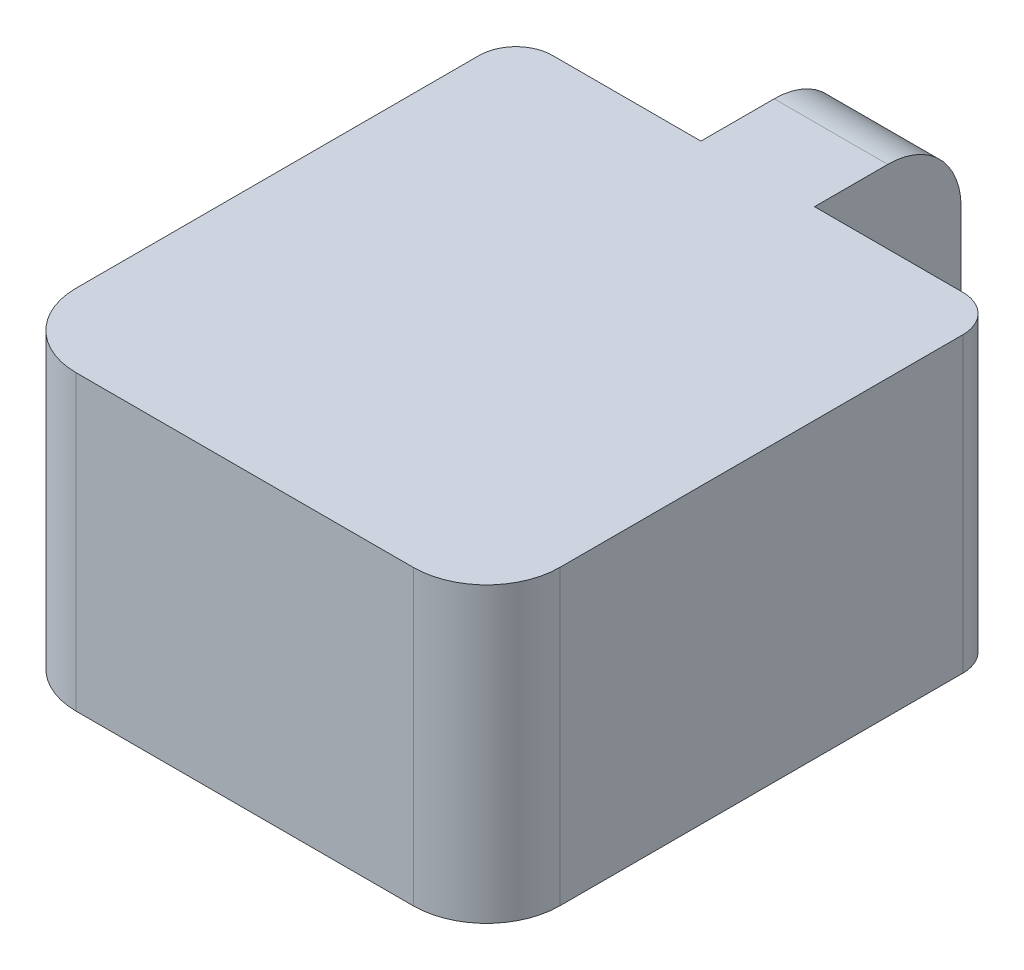
ISO-10303-21;
HEADER;
FILE_DESCRIPTION(('STEP AP214'),'2;1');
FILE_NAME('part.step','',(''),(''),'','','');
FILE_SCHEMA(('AUTOMOTIVE_DESIGN { 1 0 10303 214 1 1 1 1 }'));
ENDSEC;
DATA;
#1=APPLICATION_CONTEXT('core data for automotive mechanical design processes');
#2=APPLICATION_PROTOCOL_DEFINITION('international standard','automotive_design',2000,#1);
#3=PRODUCT_CONTEXT('',#1,'mechanical');
#4=PRODUCT('Part','Part','',(#3));
#5=PRODUCT_RELATED_PRODUCT_CATEGORY('part','',(#4));
#6=PRODUCT_DEFINITION_FORMATION('','',#4);
#7=PRODUCT_DEFINITION_CONTEXT('part definition',#1,'design');
#8=PRODUCT_DEFINITION('design','',#6,#7);
#9=PRODUCT_DEFINITION_SHAPE('','',#8);
#10=(LENGTH_UNIT() NAMED_UNIT(*) SI_UNIT(.MILLI.,.METRE.));
#11=(NAMED_UNIT(*) PLANE_ANGLE_UNIT() SI_UNIT($,.RADIAN.));
#12=(NAMED_UNIT(*) SI_UNIT($,.STERADIAN.) SOLID_ANGLE_UNIT());
#13=UNCERTAINTY_MEASURE_WITH_UNIT(LENGTH_MEASURE(1.E-05),#10,'distance_accuracy_value','');
#14=(GEOMETRIC_REPRESENTATION_CONTEXT(3) GLOBAL_UNCERTAINTY_ASSIGNED_CONTEXT((#13)) GLOBAL_UNIT_ASSIGNED_CONTEXT((#10,
#11,#12)) REPRESENTATION_CONTEXT('',''));
#15=CARTESIAN_POINT('',(0.,0.,0.));
#16=DIRECTION('',(0.,0.,1.));
#17=DIRECTION('',(1.,0.,0.));
#18=AXIS2_PLACEMENT_3D('',#15,#16,#17);
#19=CARTESIAN_POINT('',(0.,40.,20.));
#20=DIRECTION('',(1.,0.,0.));
#21=DIRECTION('',(0.,0.,-1.));
#22=AXIS2_PLACEMENT_3D('',#19,#20,#21);
#23=PLANE('',#22);
#24=CARTESIAN_POINT('',(0.,20.,10.));
#25=DIRECTION('',(-1.,0.,0.));
#26=DIRECTION('',(0.,0.,1.));
#27=AXIS2_PLACEMENT_3D('',#24,#25,#26);
#28=CIRCLE('',#27,5.);
#29=CARTESIAN_POINT('',(0.,20.,15.));
#30=VERTEX_POINT('',#29);
#31=EDGE_CURVE('E390',#30,#30,#28,.T.);
#32=ORIENTED_EDGE('',*,*,#31,.F.);
#33=EDGE_LOOP('',(#32));
#34=FACE_BOUND('',#33,.T.);
#35=DIRECTION('',(0.,-1.,0.));
#36=VECTOR('',#35,1.);
#37=CARTESIAN_POINT('',(0.,40.,0.));
#38=LINE('',#37,#36);
#39=CARTESIAN_POINT('',(0.,30.,0.));
#40=VERTEX_POINT('',#39);
#41=CARTESIAN_POINT('',(0.,15.,0.));
#42=VERTEX_POINT('',#41);
#43=EDGE_CURVE('E234',#40,#42,#38,.T.);
#44=ORIENTED_EDGE('',*,*,#43,.T.);
#45=CARTESIAN_POINT('',(0.,15.,5.));
#46=DIRECTION('',(1.,0.,0.));
#47=DIRECTION('',(0.,0.,-1.));
#48=AXIS2_PLACEMENT_3D('',#45,#46,#47);
#49=CIRCLE('',#48,5.);
#50=CARTESIAN_POINT('',(0.,10.,5.));
#51=VERTEX_POINT('',#50);
#52=EDGE_CURVE('E152',#42,#51,#49,.F.);
#53=ORIENTED_EDGE('',*,*,#52,.T.);
#54=DIRECTION('',(0.,0.,-1.));
#55=VECTOR('',#54,1.);
#56=CARTESIAN_POINT('',(0.,10.,0.));
#57=LINE('',#56,#55);
#58=CARTESIAN_POINT('',(0.,10.,20.));
#59=VERTEX_POINT('',#58);
#60=EDGE_CURVE('E138',#59,#51,#57,.T.);
#61=ORIENTED_EDGE('',*,*,#60,.F.);
#62=DIRECTION('',(0.,-1.,0.));
#63=VECTOR('',#62,1.);
#64=CARTESIAN_POINT('',(0.,40.,20.));
#65=LINE('',#64,#63);
#66=CARTESIAN_POINT('',(0.,40.,20.));
#67=VERTEX_POINT('',#66);
#68=EDGE_CURVE('E151',#67,#59,#65,.T.);
#69=ORIENTED_EDGE('',*,*,#68,.F.);
#70=DIRECTION('',(0.,0.,1.));
#71=VECTOR('',#70,1.);
#72=CARTESIAN_POINT('',(0.,40.,20.));
#73=LINE('',#72,#71);
#74=CARTESIAN_POINT('',(0.,40.,10.));
#75=VERTEX_POINT('',#74);
#76=EDGE_CURVE('E226',#75,#67,#73,.T.);
#77=ORIENTED_EDGE('',*,*,#76,.F.);
#78=CARTESIAN_POINT('',(0.,30.,10.));
#79=DIRECTION('',(1.,0.,0.));
#80=DIRECTION('',(0.,0.,-1.));
#81=AXIS2_PLACEMENT_3D('',#78,#79,#80);
#82=CIRCLE('',#81,10.);
#83=EDGE_CURVE('E163',#75,#40,#82,.F.);
#84=ORIENTED_EDGE('',*,*,#83,.T.);
#85=EDGE_LOOP('',(#44,#53,#61,#69,#77,#84));
#86=FACE_BOUND('',#85,.T.);
#87=ADVANCED_FACE('F33',(#34,#86),#23,.F.);
#88=CARTESIAN_POINT('',(-25.25,40.,90.));
#89=DIRECTION('',(1.,0.,0.));
#90=DIRECTION('',(0.,0.,-1.));
#91=AXIS2_PLACEMENT_3D('',#88,#89,#90);
#92=PLANE('',#91);
#93=DIRECTION('',(0.,0.,1.));
#94=VECTOR('',#93,1.);
#95=CARTESIAN_POINT('',(-25.25,40.,90.));
#96=LINE('',#95,#94);
#97=CARTESIAN_POINT('',(-25.25,40.,25.));
#98=VERTEX_POINT('',#97);
#99=CARTESIAN_POINT('',(-25.25,40.,80.));
#100=VERTEX_POINT('',#99);
#101=EDGE_CURVE('E255',#98,#100,#96,.T.);
#102=ORIENTED_EDGE('',*,*,#101,.F.);
#103=DIRECTION('',(0.,-1.,0.));
#104=VECTOR('',#103,1.);
#105=CARTESIAN_POINT('',(-25.25,40.,25.));
#106=LINE('',#105,#104);
#107=CARTESIAN_POINT('',(-25.25,0.,25.));
#108=VERTEX_POINT('',#107);
#109=EDGE_CURVE('E204',#98,#108,#106,.T.);
#110=ORIENTED_EDGE('',*,*,#109,.T.);
#111=DIRECTION('',(0.,0.,1.));
#112=VECTOR('',#111,1.);
#113=CARTESIAN_POINT('',(-25.25,0.,90.));
#114=LINE('',#113,#112);
#115=CARTESIAN_POINT('',(-25.25,0.,80.));
#116=VERTEX_POINT('',#115);
#117=EDGE_CURVE('E250',#108,#116,#114,.T.);
#118=ORIENTED_EDGE('',*,*,#117,.T.);
#119=DIRECTION('',(0.,-1.,0.));
#120=VECTOR('',#119,1.);
#121=CARTESIAN_POINT('',(-25.25,40.,80.));
#122=LINE('',#121,#120);
#123=EDGE_CURVE('E191',#116,#100,#122,.F.);
#124=ORIENTED_EDGE('',*,*,#123,.T.);
#125=EDGE_LOOP('',(#102,#110,#118,#124));
#126=FACE_BOUND('',#125,.T.);
#127=ADVANCED_FACE('F285',(#126),#92,.F.);
#128=CARTESIAN_POINT('',(40.75,40.,90.));
#129=DIRECTION('',(0.,0.,-1.));
#130=DIRECTION('',(-1.,0.,0.));
#131=AXIS2_PLACEMENT_3D('',#128,#129,#130);
#132=PLANE('',#131);
#133=DIRECTION('',(1.,0.,0.));
#134=VECTOR('',#133,1.);
#135=CARTESIAN_POINT('',(40.75,40.,90.));
#136=LINE('',#135,#134);
#137=CARTESIAN_POINT('',(-15.25,40.,90.));
#138=VERTEX_POINT('',#137);
#139=CARTESIAN_POINT('',(30.75,40.,90.));
#140=VERTEX_POINT('',#139);
#141=EDGE_CURVE('E257',#138,#140,#136,.T.);
#142=ORIENTED_EDGE('',*,*,#141,.F.);
#143=DIRECTION('',(0.,-1.,0.));
#144=VECTOR('',#143,1.);
#145=CARTESIAN_POINT('',(-15.25,40.,90.));
#146=LINE('',#145,#144);
#147=CARTESIAN_POINT('',(-15.25,0.,90.));
#148=VERTEX_POINT('',#147);
#149=EDGE_CURVE('E185',#138,#148,#146,.T.);
#150=ORIENTED_EDGE('',*,*,#149,.T.);
#151=DIRECTION('',(1.,0.,0.));
#152=VECTOR('',#151,1.);
#153=CARTESIAN_POINT('',(40.75,0.,90.));
#154=LINE('',#153,#152);
#155=CARTESIAN_POINT('',(30.75,0.,90.));
#156=VERTEX_POINT('',#155);
#157=EDGE_CURVE('E230',#148,#156,#154,.T.);
#158=ORIENTED_EDGE('',*,*,#157,.T.);
#159=DIRECTION('',(0.,-1.,0.));
#160=VECTOR('',#159,1.);
#161=CARTESIAN_POINT('',(30.75,40.,90.));
#162=LINE('',#161,#160);
#163=EDGE_CURVE('E180',#156,#140,#162,.F.);
#164=ORIENTED_EDGE('',*,*,#163,.T.);
#165=EDGE_LOOP('',(#142,#150,#158,#164));
#166=FACE_BOUND('',#165,.T.);
#167=ADVANCED_FACE('F266',(#166),#132,.F.);
#168=CARTESIAN_POINT('',(40.75,40.,20.));
#169=DIRECTION('',(-1.,0.,0.));
#170=DIRECTION('',(0.,0.,1.));
#171=AXIS2_PLACEMENT_3D('',#168,#169,#170);
#172=PLANE('',#171);
#173=DIRECTION('',(0.,0.,-1.));
#174=VECTOR('',#173,1.);
#175=CARTESIAN_POINT('',(40.75,0.,20.));
#176=LINE('',#175,#174);
#177=CARTESIAN_POINT('',(40.75,0.,80.));
#178=VERTEX_POINT('',#177);
#179=CARTESIAN_POINT('',(40.75,0.,25.));
#180=VERTEX_POINT('',#179);
#181=EDGE_CURVE('E227',#178,#180,#176,.T.);
#182=ORIENTED_EDGE('',*,*,#181,.T.);
#183=DIRECTION('',(0.,-1.,0.));
#184=VECTOR('',#183,1.);
#185=CARTESIAN_POINT('',(40.75,40.,25.));
#186=LINE('',#185,#184);
#187=CARTESIAN_POINT('',(40.75,40.,25.));
#188=VERTEX_POINT('',#187);
#189=EDGE_CURVE('E42',#180,#188,#186,.F.);
#190=ORIENTED_EDGE('',*,*,#189,.T.);
#191=DIRECTION('',(0.,0.,-1.));
#192=VECTOR('',#191,1.);
#193=CARTESIAN_POINT('',(40.75,40.,20.));
#194=LINE('',#193,#192);
#195=CARTESIAN_POINT('',(40.75,40.,80.));
#196=VERTEX_POINT('',#195);
#197=EDGE_CURVE('E259',#196,#188,#194,.T.);
#198=ORIENTED_EDGE('',*,*,#197,.F.);
#199=DIRECTION('',(0.,-1.,0.));
#200=VECTOR('',#199,1.);
#201=CARTESIAN_POINT('',(40.75,40.,80.));
#202=LINE('',#201,#200);
#203=EDGE_CURVE('E174',#196,#178,#202,.T.);
#204=ORIENTED_EDGE('',*,*,#203,.T.);
#205=EDGE_LOOP('',(#182,#190,#198,#204));
#206=FACE_BOUND('',#205,.T.);
#207=ADVANCED_FACE('F275',(#206),#172,.F.);
#208=CARTESIAN_POINT('',(15.5,40.,20.));
#209=DIRECTION('',(0.,0.,1.));
#210=DIRECTION('',(1.,0.,0.));
#211=AXIS2_PLACEMENT_3D('',#208,#209,#210);
#212=PLANE('',#211);
#213=DIRECTION('',(-1.,0.,0.));
#214=VECTOR('',#213,1.);
#215=CARTESIAN_POINT('',(15.5,40.,20.));
#216=LINE('',#215,#214);
#217=CARTESIAN_POINT('',(35.75,40.,20.));
#218=VERTEX_POINT('',#217);
#219=CARTESIAN_POINT('',(15.5,40.,20.));
#220=VERTEX_POINT('',#219);
#221=EDGE_CURVE('E220',#218,#220,#216,.T.);
#222=ORIENTED_EDGE('',*,*,#221,.F.);
#223=DIRECTION('',(0.,-1.,0.));
#224=VECTOR('',#223,1.);
#225=CARTESIAN_POINT('',(35.75,40.,20.));
#226=LINE('',#225,#224);
#227=CARTESIAN_POINT('',(35.75,0.,20.));
#228=VERTEX_POINT('',#227);
#229=EDGE_CURVE('E214',#218,#228,#226,.T.);
#230=ORIENTED_EDGE('',*,*,#229,.T.);
#231=DIRECTION('',(-1.,0.,0.));
#232=VECTOR('',#231,1.);
#233=CARTESIAN_POINT('',(15.5,0.,20.));
#234=LINE('',#233,#232);
#235=CARTESIAN_POINT('',(-20.25,0.,20.));
#236=VERTEX_POINT('',#235);
#237=EDGE_CURVE('E219',#228,#236,#234,.T.);
#238=ORIENTED_EDGE('',*,*,#237,.T.);
#239=DIRECTION('',(0.,-1.,0.));
#240=VECTOR('',#239,1.);
#241=CARTESIAN_POINT('',(-20.25,40.,20.));
#242=LINE('',#241,#240);
#243=CARTESIAN_POINT('',(-20.25,40.,20.));
#244=VERTEX_POINT('',#243);
#245=EDGE_CURVE('E210',#236,#244,#242,.F.);
#246=ORIENTED_EDGE('',*,*,#245,.T.);
#247=DIRECTION('',(-1.,0.,0.));
#248=VECTOR('',#247,1.);
#249=CARTESIAN_POINT('',(-25.25,40.,20.));
#250=LINE('',#249,#248);
#251=EDGE_CURVE('E158',#67,#244,#250,.T.);
#252=ORIENTED_EDGE('',*,*,#251,.F.);
#253=ORIENTED_EDGE('',*,*,#68,.T.);
#254=DIRECTION('',(-1.,0.,0.));
#255=VECTOR('',#254,1.);
#256=CARTESIAN_POINT('',(40.,10.,20.));
#257=LINE('',#256,#255);
#258=CARTESIAN_POINT('',(15.5,10.,20.));
#259=VERTEX_POINT('',#258);
#260=EDGE_CURVE('E135',#259,#59,#257,.T.);
#261=ORIENTED_EDGE('',*,*,#260,.F.);
#262=DIRECTION('',(0.,-1.,0.));
#263=VECTOR('',#262,1.);
#264=CARTESIAN_POINT('',(15.5,40.,20.));
#265=LINE('',#264,#263);
#266=EDGE_CURVE('E160',#220,#259,#265,.T.);
#267=ORIENTED_EDGE('',*,*,#266,.F.);
#268=EDGE_LOOP('',(#222,#230,#238,#246,#252,#253,#261,#267));
#269=FACE_BOUND('',#268,.T.);
#270=ADVANCED_FACE('F156',(#269),#212,.F.);
#271=CARTESIAN_POINT('',(15.5,40.,0.));
#272=DIRECTION('',(-1.,0.,0.));
#273=DIRECTION('',(0.,0.,1.));
#274=AXIS2_PLACEMENT_3D('',#271,#272,#273);
#275=PLANE('',#274);
#276=CARTESIAN_POINT('',(15.5,20.,10.));
#277=DIRECTION('',(-1.,0.,0.));
#278=DIRECTION('',(0.,0.,1.));
#279=AXIS2_PLACEMENT_3D('',#276,#277,#278);
#280=CIRCLE('',#279,5.);
#281=CARTESIAN_POINT('',(15.5,20.,15.));
#282=VERTEX_POINT('',#281);
#283=EDGE_CURVE('E37',#282,#282,#280,.T.);
#284=ORIENTED_EDGE('',*,*,#283,.T.);
#285=EDGE_LOOP('',(#284));
#286=FACE_BOUND('',#285,.T.);
#287=DIRECTION('',(0.,0.,-1.));
#288=VECTOR('',#287,1.);
#289=CARTESIAN_POINT('',(15.5,10.,0.));
#290=LINE('',#289,#288);
#291=CARTESIAN_POINT('',(15.5,10.,5.));
#292=VERTEX_POINT('',#291);
#293=EDGE_CURVE('E141',#259,#292,#290,.T.);
#294=ORIENTED_EDGE('',*,*,#293,.T.);
#295=CARTESIAN_POINT('',(15.5,15.,5.));
#296=DIRECTION('',(-1.,0.,0.));
#297=DIRECTION('',(0.,0.,1.));
#298=AXIS2_PLACEMENT_3D('',#295,#296,#297);
#299=CIRCLE('',#298,5.);
#300=CARTESIAN_POINT('',(15.5,15.,0.));
#301=VERTEX_POINT('',#300);
#302=EDGE_CURVE('E202',#292,#301,#299,.F.);
#303=ORIENTED_EDGE('',*,*,#302,.T.);
#304=DIRECTION('',(0.,-1.,0.));
#305=VECTOR('',#304,1.);
#306=CARTESIAN_POINT('',(15.5,40.,0.));
#307=LINE('',#306,#305);
#308=CARTESIAN_POINT('',(15.5,30.,0.));
#309=VERTEX_POINT('',#308);
#310=EDGE_CURVE('E165',#309,#301,#307,.T.);
#311=ORIENTED_EDGE('',*,*,#310,.F.);
#312=CARTESIAN_POINT('',(15.5,30.,10.));
#313=DIRECTION('',(-1.,0.,0.));
#314=DIRECTION('',(0.,0.,1.));
#315=AXIS2_PLACEMENT_3D('',#312,#313,#314);
#316=CIRCLE('',#315,10.);
#317=CARTESIAN_POINT('',(15.5,40.,10.));
#318=VERTEX_POINT('',#317);
#319=EDGE_CURVE('E172',#309,#318,#316,.F.);
#320=ORIENTED_EDGE('',*,*,#319,.T.);
#321=DIRECTION('',(0.,0.,-1.));
#322=VECTOR('',#321,1.);
#323=CARTESIAN_POINT('',(15.5,40.,0.));
#324=LINE('',#323,#322);
#325=EDGE_CURVE('E235',#220,#318,#324,.T.);
#326=ORIENTED_EDGE('',*,*,#325,.F.);
#327=ORIENTED_EDGE('',*,*,#266,.T.);
#328=EDGE_LOOP('',(#294,#303,#311,#320,#326,#327));
#329=FACE_BOUND('',#328,.T.);
#330=ADVANCED_FACE('F248',(#286,#329),#275,.F.);
#331=CARTESIAN_POINT('',(0.,40.,0.));
#332=DIRECTION('',(0.,0.,1.));
#333=DIRECTION('',(1.,0.,0.));
#334=AXIS2_PLACEMENT_3D('',#331,#332,#333);
#335=PLANE('',#334);
#336=ORIENTED_EDGE('',*,*,#310,.T.);
#337=DIRECTION('',(-1.,0.,0.));
#338=VECTOR('',#337,1.);
#339=CARTESIAN_POINT('',(0.,15.,0.));
#340=LINE('',#339,#338);
#341=EDGE_CURVE('E196',#301,#42,#340,.T.);
#342=ORIENTED_EDGE('',*,*,#341,.T.);
#343=ORIENTED_EDGE('',*,*,#43,.F.);
#344=DIRECTION('',(-1.,0.,0.));
#345=VECTOR('',#344,1.);
#346=CARTESIAN_POINT('',(0.,30.,0.));
#347=LINE('',#346,#345);
#348=EDGE_CURVE('E170',#40,#309,#347,.F.);
#349=ORIENTED_EDGE('',*,*,#348,.T.);
#350=EDGE_LOOP('',(#336,#342,#343,#349));
#351=FACE_BOUND('',#350,.T.);
#352=ADVANCED_FACE('F240',(#351),#335,.F.);
#353=CARTESIAN_POINT('',(0.,40.,0.));
#354=DIRECTION('',(0.,-1.,0.));
#355=DIRECTION('',(0.,0.,-1.));
#356=AXIS2_PLACEMENT_3D('',#353,#354,#355);
#357=PLANE('',#356);
#358=ORIENTED_EDGE('',*,*,#197,.T.);
#359=CARTESIAN_POINT('',(35.75,40.,25.));
#360=DIRECTION('',(0.,-1.,0.));
#361=DIRECTION('',(0.,0.,-1.));
#362=AXIS2_PLACEMENT_3D('',#359,#360,#361);
#363=CIRCLE('',#362,5.);
#364=EDGE_CURVE('E11',#188,#218,#363,.F.);
#365=ORIENTED_EDGE('',*,*,#364,.T.);
#366=ORIENTED_EDGE('',*,*,#221,.T.);
#367=ORIENTED_EDGE('',*,*,#325,.T.);
#368=DIRECTION('',(-1.,0.,0.));
#369=VECTOR('',#368,1.);
#370=CARTESIAN_POINT('',(0.,40.,10.));
#371=LINE('',#370,#369);
#372=EDGE_CURVE('E159',#318,#75,#371,.T.);
#373=ORIENTED_EDGE('',*,*,#372,.T.);
#374=ORIENTED_EDGE('',*,*,#76,.T.);
#375=ORIENTED_EDGE('',*,*,#251,.T.);
#376=CARTESIAN_POINT('',(-20.25,40.,25.));
#377=DIRECTION('',(0.,-1.,0.));
#378=DIRECTION('',(0.,0.,-1.));
#379=AXIS2_PLACEMENT_3D('',#376,#377,#378);
#380=CIRCLE('',#379,5.);
#381=EDGE_CURVE('E212',#244,#98,#380,.F.);
#382=ORIENTED_EDGE('',*,*,#381,.T.);
#383=ORIENTED_EDGE('',*,*,#101,.T.);
#384=CARTESIAN_POINT('',(-15.25,40.,80.));
#385=DIRECTION('',(0.,-1.,0.));
#386=DIRECTION('',(0.,0.,-1.));
#387=AXIS2_PLACEMENT_3D('',#384,#385,#386);
#388=CIRCLE('',#387,10.);
#389=EDGE_CURVE('E194',#100,#138,#388,.F.);
#390=ORIENTED_EDGE('',*,*,#389,.T.);
#391=ORIENTED_EDGE('',*,*,#141,.T.);
#392=CARTESIAN_POINT('',(30.75,40.,80.));
#393=DIRECTION('',(0.,-1.,0.));
#394=DIRECTION('',(0.,0.,-1.));
#395=AXIS2_PLACEMENT_3D('',#392,#393,#394);
#396=CIRCLE('',#395,10.);
#397=EDGE_CURVE('E183',#140,#196,#396,.F.);
#398=ORIENTED_EDGE('',*,*,#397,.T.);
#399=EDGE_LOOP('',(#358,#365,#366,#367,#373,#374,#375,#382,#383,#390,#391,#398));
#400=FACE_BOUND('',#399,.T.);
#401=ADVANCED_FACE('F274',(#400),#357,.F.);
#402=CARTESIAN_POINT('',(0.,0.,0.));
#403=DIRECTION('',(0.,-1.,0.));
#404=DIRECTION('',(0.,0.,-1.));
#405=AXIS2_PLACEMENT_3D('',#402,#403,#404);
#406=PLANE('',#405);
#407=ORIENTED_EDGE('',*,*,#237,.F.);
#408=CARTESIAN_POINT('',(35.75,0.,25.));
#409=DIRECTION('',(0.,-1.,0.));
#410=DIRECTION('',(0.,0.,-1.));
#411=AXIS2_PLACEMENT_3D('',#408,#409,#410);
#412=CIRCLE('',#411,5.);
#413=EDGE_CURVE('E56',#228,#180,#412,.T.);
#414=ORIENTED_EDGE('',*,*,#413,.T.);
#415=ORIENTED_EDGE('',*,*,#181,.F.);
#416=CARTESIAN_POINT('',(30.75,0.,80.));
#417=DIRECTION('',(0.,-1.,0.));
#418=DIRECTION('',(0.,0.,-1.));
#419=AXIS2_PLACEMENT_3D('',#416,#417,#418);
#420=CIRCLE('',#419,10.);
#421=EDGE_CURVE('E177',#178,#156,#420,.T.);
#422=ORIENTED_EDGE('',*,*,#421,.T.);
#423=ORIENTED_EDGE('',*,*,#157,.F.);
#424=CARTESIAN_POINT('',(-15.25,0.,80.));
#425=DIRECTION('',(0.,-1.,0.));
#426=DIRECTION('',(0.,0.,-1.));
#427=AXIS2_PLACEMENT_3D('',#424,#425,#426);
#428=CIRCLE('',#427,10.);
#429=EDGE_CURVE('E188',#148,#116,#428,.T.);
#430=ORIENTED_EDGE('',*,*,#429,.T.);
#431=ORIENTED_EDGE('',*,*,#117,.F.);
#432=CARTESIAN_POINT('',(-20.25,0.,25.));
#433=DIRECTION('',(0.,-1.,0.));
#434=DIRECTION('',(0.,0.,-1.));
#435=AXIS2_PLACEMENT_3D('',#432,#433,#434);
#436=CIRCLE('',#435,5.);
#437=EDGE_CURVE('E207',#108,#236,#436,.T.);
#438=ORIENTED_EDGE('',*,*,#437,.T.);
#439=EDGE_LOOP('',(#407,#414,#415,#422,#423,#430,#431,#438));
#440=FACE_BOUND('',#439,.T.);
#441=ADVANCED_FACE('F223',(#440),#406,.T.);
#442=CARTESIAN_POINT('',(0.,30.,10.));
#443=DIRECTION('',(-1.,0.,0.));
#444=DIRECTION('',(0.,0.,1.));
#445=AXIS2_PLACEMENT_3D('',#442,#443,#444);
#446=CYLINDRICAL_SURFACE('',#445,10.);
#447=ORIENTED_EDGE('',*,*,#319,.F.);
#448=ORIENTED_EDGE('',*,*,#348,.F.);
#449=ORIENTED_EDGE('',*,*,#83,.F.);
#450=ORIENTED_EDGE('',*,*,#372,.F.);
#451=EDGE_LOOP('',(#447,#448,#449,#450));
#452=FACE_BOUND('',#451,.T.);
#453=ADVANCED_FACE('F278',(#452),#446,.T.);
#454=CARTESIAN_POINT('',(30.75,40.,80.));
#455=DIRECTION('',(0.,-1.,0.));
#456=DIRECTION('',(0.,0.,-1.));
#457=AXIS2_PLACEMENT_3D('',#454,#455,#456);
#458=CYLINDRICAL_SURFACE('',#457,10.);
#459=ORIENTED_EDGE('',*,*,#397,.F.);
#460=ORIENTED_EDGE('',*,*,#163,.F.);
#461=ORIENTED_EDGE('',*,*,#421,.F.);
#462=ORIENTED_EDGE('',*,*,#203,.F.);
#463=EDGE_LOOP('',(#459,#460,#461,#462));
#464=FACE_BOUND('',#463,.T.);
#465=ADVANCED_FACE('F272',(#464),#458,.T.);
#466=CARTESIAN_POINT('',(-15.25,40.,80.));
#467=DIRECTION('',(0.,-1.,0.));
#468=DIRECTION('',(0.,0.,-1.));
#469=AXIS2_PLACEMENT_3D('',#466,#467,#468);
#470=CYLINDRICAL_SURFACE('',#469,10.);
#471=ORIENTED_EDGE('',*,*,#389,.F.);
#472=ORIENTED_EDGE('',*,*,#123,.F.);
#473=ORIENTED_EDGE('',*,*,#429,.F.);
#474=ORIENTED_EDGE('',*,*,#149,.F.);
#475=EDGE_LOOP('',(#471,#472,#473,#474));
#476=FACE_BOUND('',#475,.T.);
#477=ADVANCED_FACE('F289',(#476),#470,.T.);
#478=CARTESIAN_POINT('',(40.,10.,0.));
#479=DIRECTION('',(0.,1.,0.));
#480=DIRECTION('',(0.,0.,1.));
#481=AXIS2_PLACEMENT_3D('',#478,#479,#480);
#482=PLANE('',#481);
#483=ORIENTED_EDGE('',*,*,#60,.T.);
#484=DIRECTION('',(-1.,0.,0.));
#485=VECTOR('',#484,1.);
#486=CARTESIAN_POINT('',(40.,10.,5.));
#487=LINE('',#486,#485);
#488=EDGE_CURVE('E200',#51,#292,#487,.F.);
#489=ORIENTED_EDGE('',*,*,#488,.T.);
#490=ORIENTED_EDGE('',*,*,#293,.F.);
#491=ORIENTED_EDGE('',*,*,#260,.T.);
#492=EDGE_LOOP('',(#483,#489,#490,#491));
#493=FACE_BOUND('',#492,.T.);
#494=ADVANCED_FACE('F137',(#493),#482,.F.);
#495=CARTESIAN_POINT('',(0.,15.,5.));
#496=DIRECTION('',(-1.,0.,0.));
#497=DIRECTION('',(0.,0.,1.));
#498=AXIS2_PLACEMENT_3D('',#495,#496,#497);
#499=CYLINDRICAL_SURFACE('',#498,5.);
#500=ORIENTED_EDGE('',*,*,#302,.F.);
#501=ORIENTED_EDGE('',*,*,#488,.F.);
#502=ORIENTED_EDGE('',*,*,#52,.F.);
#503=ORIENTED_EDGE('',*,*,#341,.F.);
#504=EDGE_LOOP('',(#500,#501,#502,#503));
#505=FACE_BOUND('',#504,.T.);
#506=ADVANCED_FACE('F247',(#505),#499,.T.);
#507=CARTESIAN_POINT('',(-20.25,40.,25.));
#508=DIRECTION('',(0.,-1.,0.));
#509=DIRECTION('',(0.,0.,-1.));
#510=AXIS2_PLACEMENT_3D('',#507,#508,#509);
#511=CYLINDRICAL_SURFACE('',#510,5.);
#512=ORIENTED_EDGE('',*,*,#381,.F.);
#513=ORIENTED_EDGE('',*,*,#245,.F.);
#514=ORIENTED_EDGE('',*,*,#437,.F.);
#515=ORIENTED_EDGE('',*,*,#109,.F.);
#516=EDGE_LOOP('',(#512,#513,#514,#515));
#517=FACE_BOUND('',#516,.T.);
#518=ADVANCED_FACE('F283',(#517),#511,.T.);
#519=CARTESIAN_POINT('',(35.75,40.,25.));
#520=DIRECTION('',(0.,-1.,0.));
#521=DIRECTION('',(0.,0.,-1.));
#522=AXIS2_PLACEMENT_3D('',#519,#520,#521);
#523=CYLINDRICAL_SURFACE('',#522,5.);
#524=ORIENTED_EDGE('',*,*,#364,.F.);
#525=ORIENTED_EDGE('',*,*,#189,.F.);
#526=ORIENTED_EDGE('',*,*,#413,.F.);
#527=ORIENTED_EDGE('',*,*,#229,.F.);
#528=EDGE_LOOP('',(#524,#525,#526,#527));
#529=FACE_BOUND('',#528,.T.);
#530=ADVANCED_FACE('F35',(#529),#523,.T.);
#531=CARTESIAN_POINT('',(28.,20.,10.));
#532=DIRECTION('',(-1.,0.,0.));
#533=DIRECTION('',(0.,0.,1.));
#534=AXIS2_PLACEMENT_3D('',#531,#532,#533);
#535=CYLINDRICAL_SURFACE('',#534,5.);
#536=ORIENTED_EDGE('',*,*,#31,.T.);
#537=EDGE_LOOP('',(#536));
#538=FACE_BOUND('',#537,.T.);
#539=ORIENTED_EDGE('',*,*,#283,.F.);
#540=EDGE_LOOP('',(#539));
#541=FACE_BOUND('',#540,.T.);
#542=ADVANCED_FACE('F372',(#538,#541),#535,.F.);
#543=CLOSED_SHELL('',(#87,#127,#167,#207,#270,#330,#352,#401,#441,#453,#465,#477,#494,#506,#518,
#530,#542));
#544=MANIFOLD_SOLID_BREP('B2',#543);
#545=ADVANCED_BREP_SHAPE_REPRESENTATION('',(#18,#544),#14);
#546=SHAPE_DEFINITION_REPRESENTATION(#9,#545);
ENDSEC;
END-ISO-10303-21;
